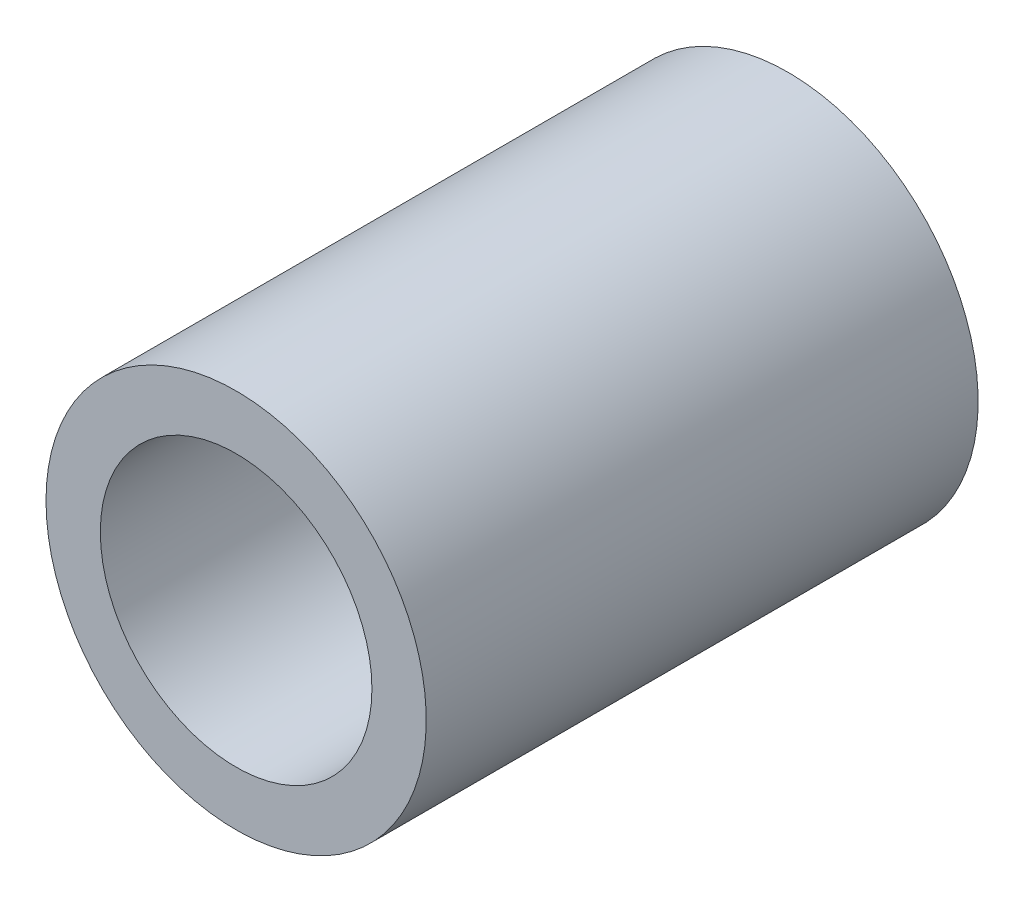
ISO-10303-21;
HEADER;
FILE_DESCRIPTION(('STEP AP214'),'2;1');
FILE_NAME('part.step','',(''),(''),'','','');
FILE_SCHEMA(('AUTOMOTIVE_DESIGN { 1 0 10303 214 1 1 1 1 }'));
ENDSEC;
DATA;
#1=APPLICATION_CONTEXT('core data for automotive mechanical design processes');
#2=APPLICATION_PROTOCOL_DEFINITION('international standard','automotive_design',2000,#1);
#3=PRODUCT_CONTEXT('',#1,'mechanical');
#4=PRODUCT('Part','Part','',(#3));
#5=PRODUCT_RELATED_PRODUCT_CATEGORY('part','',(#4));
#6=PRODUCT_DEFINITION_FORMATION('','',#4);
#7=PRODUCT_DEFINITION_CONTEXT('part definition',#1,'design');
#8=PRODUCT_DEFINITION('design','',#6,#7);
#9=PRODUCT_DEFINITION_SHAPE('','',#8);
#10=(LENGTH_UNIT() NAMED_UNIT(*) SI_UNIT(.MILLI.,.METRE.));
#11=(NAMED_UNIT(*) PLANE_ANGLE_UNIT() SI_UNIT($,.RADIAN.));
#12=(NAMED_UNIT(*) SI_UNIT($,.STERADIAN.) SOLID_ANGLE_UNIT());
#13=UNCERTAINTY_MEASURE_WITH_UNIT(LENGTH_MEASURE(1.E-05),#10,'distance_accuracy_value','');
#14=(GEOMETRIC_REPRESENTATION_CONTEXT(3) GLOBAL_UNCERTAINTY_ASSIGNED_CONTEXT((#13)) GLOBAL_UNIT_ASSIGNED_CONTEXT((#10,
#11,#12)) REPRESENTATION_CONTEXT('',''));
#15=CARTESIAN_POINT('',(0.,0.,0.));
#16=DIRECTION('',(0.,0.,1.));
#17=DIRECTION('',(1.,0.,0.));
#18=AXIS2_PLACEMENT_3D('',#15,#16,#17);
#19=CARTESIAN_POINT('',(0.,0.,50.8));
#20=DIRECTION('',(0.,0.,-1.));
#21=DIRECTION('',(-1.,0.,0.));
#22=AXIS2_PLACEMENT_3D('',#19,#20,#21);
#23=CYLINDRICAL_SURFACE('',#22,12.5);
#24=CARTESIAN_POINT('',(0.,0.,0.));
#25=DIRECTION('',(0.,0.,-1.));
#26=DIRECTION('',(-1.,0.,0.));
#27=AXIS2_PLACEMENT_3D('',#24,#25,#26);
#28=CIRCLE('',#27,12.5);
#29=CARTESIAN_POINT('',(-12.5,0.,0.));
#30=VERTEX_POINT('',#29);
#31=EDGE_CURVE('E27',#30,#30,#28,.T.);
#32=ORIENTED_EDGE('',*,*,#31,.T.);
#33=EDGE_LOOP('',(#32));
#34=FACE_BOUND('',#33,.T.);
#35=CARTESIAN_POINT('',(0.,0.,50.8));
#36=DIRECTION('',(0.,0.,-1.));
#37=DIRECTION('',(-1.,0.,0.));
#38=AXIS2_PLACEMENT_3D('',#35,#36,#37);
#39=CIRCLE('',#38,12.5);
#40=CARTESIAN_POINT('',(-12.5,0.,50.8));
#41=VERTEX_POINT('',#40);
#42=EDGE_CURVE('E18',#41,#41,#39,.T.);
#43=ORIENTED_EDGE('',*,*,#42,.F.);
#44=EDGE_LOOP('',(#43));
#45=FACE_BOUND('',#44,.T.);
#46=ADVANCED_FACE('F15',(#34,#45),#23,.F.);
#47=CARTESIAN_POINT('',(0.,0.,50.8));
#48=DIRECTION('',(0.,0.,1.));
#49=DIRECTION('',(1.,0.,0.));
#50=AXIS2_PLACEMENT_3D('',#47,#48,#49);
#51=PLANE('',#50);
#52=ORIENTED_EDGE('',*,*,#42,.T.);
#53=EDGE_LOOP('',(#52));
#54=FACE_BOUND('',#53,.T.);
#55=CARTESIAN_POINT('',(0.,0.,50.8));
#56=DIRECTION('',(0.,0.,-1.));
#57=DIRECTION('',(-1.,0.,0.));
#58=AXIS2_PLACEMENT_3D('',#55,#56,#57);
#59=CIRCLE('',#58,17.5);
#60=CARTESIAN_POINT('',(-17.5,0.,50.8));
#61=VERTEX_POINT('',#60);
#62=EDGE_CURVE('E22',#61,#61,#59,.T.);
#63=ORIENTED_EDGE('',*,*,#62,.F.);
#64=EDGE_LOOP('',(#63));
#65=FACE_BOUND('',#64,.T.);
#66=ADVANCED_FACE('F35',(#54,#65),#51,.T.);
#67=CARTESIAN_POINT('',(0.,0.,0.));
#68=DIRECTION('',(0.,0.,1.));
#69=DIRECTION('',(1.,0.,0.));
#70=AXIS2_PLACEMENT_3D('',#67,#68,#69);
#71=PLANE('',#70);
#72=ORIENTED_EDGE('',*,*,#31,.F.);
#73=EDGE_LOOP('',(#72));
#74=FACE_BOUND('',#73,.T.);
#75=CARTESIAN_POINT('',(0.,0.,0.));
#76=DIRECTION('',(0.,0.,-1.));
#77=DIRECTION('',(-1.,0.,0.));
#78=AXIS2_PLACEMENT_3D('',#75,#76,#77);
#79=CIRCLE('',#78,17.5);
#80=CARTESIAN_POINT('',(-17.5,0.,0.));
#81=VERTEX_POINT('',#80);
#82=EDGE_CURVE('E10',#81,#81,#79,.F.);
#83=ORIENTED_EDGE('',*,*,#82,.F.);
#84=EDGE_LOOP('',(#83));
#85=FACE_BOUND('',#84,.T.);
#86=ADVANCED_FACE('F43',(#74,#85),#71,.F.);
#87=CARTESIAN_POINT('',(0.,0.,50.8));
#88=DIRECTION('',(0.,0.,-1.));
#89=DIRECTION('',(-1.,0.,0.));
#90=AXIS2_PLACEMENT_3D('',#87,#88,#89);
#91=CYLINDRICAL_SURFACE('',#90,17.5);
#92=ORIENTED_EDGE('',*,*,#82,.T.);
#93=EDGE_LOOP('',(#92));
#94=FACE_BOUND('',#93,.T.);
#95=ORIENTED_EDGE('',*,*,#62,.T.);
#96=EDGE_LOOP('',(#95));
#97=FACE_BOUND('',#96,.T.);
#98=ADVANCED_FACE('F44',(#94,#97),#91,.T.);
#99=CLOSED_SHELL('',(#46,#66,#86,#98));
#100=MANIFOLD_SOLID_BREP('B1',#99);
#101=ADVANCED_BREP_SHAPE_REPRESENTATION('',(#18,#100),#14);
#102=SHAPE_DEFINITION_REPRESENTATION(#9,#101);
ENDSEC;
END-ISO-10303-21;
